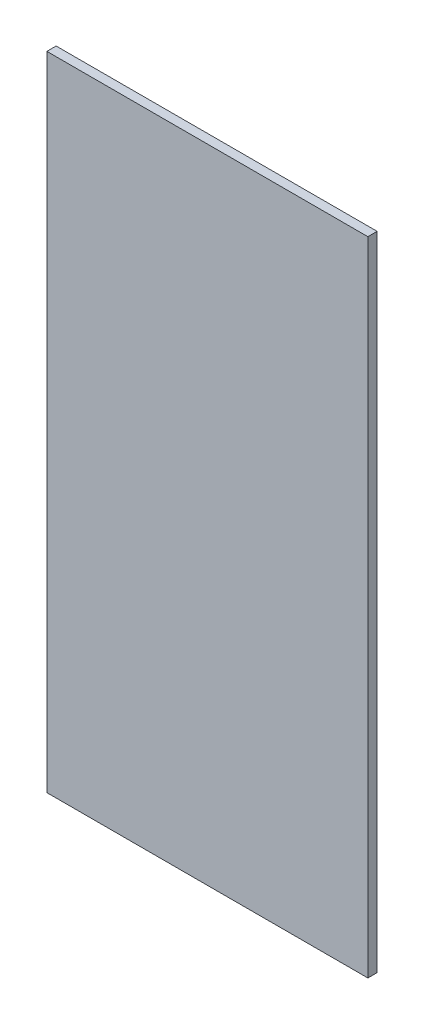
ISO-10303-21;
HEADER;
FILE_DESCRIPTION(('STEP AP214'),'2;1');
FILE_NAME('part.step','',(''),(''),'','','');
FILE_SCHEMA(('AUTOMOTIVE_DESIGN { 1 0 10303 214 1 1 1 1 }'));
ENDSEC;
DATA;
#1=APPLICATION_CONTEXT('core data for automotive mechanical design processes');
#2=APPLICATION_PROTOCOL_DEFINITION('international standard','automotive_design',2000,#1);
#3=PRODUCT_CONTEXT('',#1,'mechanical');
#4=PRODUCT('Part','Part','',(#3));
#5=PRODUCT_RELATED_PRODUCT_CATEGORY('part','',(#4));
#6=PRODUCT_DEFINITION_FORMATION('','',#4);
#7=PRODUCT_DEFINITION_CONTEXT('part definition',#1,'design');
#8=PRODUCT_DEFINITION('design','',#6,#7);
#9=PRODUCT_DEFINITION_SHAPE('','',#8);
#10=(LENGTH_UNIT() NAMED_UNIT(*) SI_UNIT(.MILLI.,.METRE.));
#11=(NAMED_UNIT(*) PLANE_ANGLE_UNIT() SI_UNIT($,.RADIAN.));
#12=(NAMED_UNIT(*) SI_UNIT($,.STERADIAN.) SOLID_ANGLE_UNIT());
#13=UNCERTAINTY_MEASURE_WITH_UNIT(LENGTH_MEASURE(1.E-05),#10,'distance_accuracy_value','');
#14=(GEOMETRIC_REPRESENTATION_CONTEXT(3) GLOBAL_UNCERTAINTY_ASSIGNED_CONTEXT((#13)) GLOBAL_UNIT_ASSIGNED_CONTEXT((#10,
#11,#12)) REPRESENTATION_CONTEXT('',''));
#15=CARTESIAN_POINT('',(0.,0.,0.));
#16=DIRECTION('',(0.,0.,1.));
#17=DIRECTION('',(1.,0.,0.));
#18=AXIS2_PLACEMENT_3D('',#15,#16,#17);
#19=CARTESIAN_POINT('',(-82.5500000000001,165.1,4.7625));
#20=DIRECTION('',(1.,0.,0.));
#21=DIRECTION('',(0.,1.,0.));
#22=AXIS2_PLACEMENT_3D('',#19,#20,#21);
#23=PLANE('',#22);
#24=DIRECTION('',(0.,-1.,0.));
#25=VECTOR('',#24,1.);
#26=CARTESIAN_POINT('',(-82.5500000000001,165.1,0.));
#27=LINE('',#26,#25);
#28=CARTESIAN_POINT('',(-82.5500000000001,165.1,0.));
#29=VERTEX_POINT('',#28);
#30=CARTESIAN_POINT('',(-82.55,-165.1,0.));
#31=VERTEX_POINT('',#30);
#32=EDGE_CURVE('E100',#29,#31,#27,.T.);
#33=ORIENTED_EDGE('',*,*,#32,.T.);
#34=DIRECTION('',(0.,0.,-1.));
#35=VECTOR('',#34,1.);
#36=CARTESIAN_POINT('',(-82.55,-165.1,4.7625));
#37=LINE('',#36,#35);
#38=CARTESIAN_POINT('',(-82.55,-165.1,4.7625));
#39=VERTEX_POINT('',#38);
#40=EDGE_CURVE('E11',#39,#31,#37,.T.);
#41=ORIENTED_EDGE('',*,*,#40,.F.);
#42=DIRECTION('',(0.,-1.,0.));
#43=VECTOR('',#42,1.);
#44=CARTESIAN_POINT('',(-82.5500000000001,165.1,4.7625));
#45=LINE('',#44,#43);
#46=CARTESIAN_POINT('',(-82.5500000000001,165.1,4.7625));
#47=VERTEX_POINT('',#46);
#48=EDGE_CURVE('E88',#47,#39,#45,.T.);
#49=ORIENTED_EDGE('',*,*,#48,.F.);
#50=DIRECTION('',(0.,0.,-1.));
#51=VECTOR('',#50,1.);
#52=CARTESIAN_POINT('',(-82.5500000000001,165.1,4.7625));
#53=LINE('',#52,#51);
#54=EDGE_CURVE('E96',#47,#29,#53,.T.);
#55=ORIENTED_EDGE('',*,*,#54,.T.);
#56=EDGE_LOOP('',(#33,#41,#49,#55));
#57=FACE_BOUND('',#56,.T.);
#58=ADVANCED_FACE('F37',(#57),#23,.F.);
#59=CARTESIAN_POINT('',(-82.55,-165.1,4.7625));
#60=DIRECTION('',(0.,1.,0.));
#61=DIRECTION('',(-1.,0.,0.));
#62=AXIS2_PLACEMENT_3D('',#59,#60,#61);
#63=PLANE('',#62);
#64=DIRECTION('',(1.,0.,0.));
#65=VECTOR('',#64,1.);
#66=CARTESIAN_POINT('',(-82.55,-165.1,0.));
#67=LINE('',#66,#65);
#68=CARTESIAN_POINT('',(82.55,-165.1,0.));
#69=VERTEX_POINT('',#68);
#70=EDGE_CURVE('E92',#31,#69,#67,.T.);
#71=ORIENTED_EDGE('',*,*,#70,.T.);
#72=DIRECTION('',(0.,0.,-1.));
#73=VECTOR('',#72,1.);
#74=CARTESIAN_POINT('',(82.55,-165.1,4.7625));
#75=LINE('',#74,#73);
#76=CARTESIAN_POINT('',(82.55,-165.1,4.7625));
#77=VERTEX_POINT('',#76);
#78=EDGE_CURVE('E45',#77,#69,#75,.T.);
#79=ORIENTED_EDGE('',*,*,#78,.F.);
#80=DIRECTION('',(1.,0.,0.));
#81=VECTOR('',#80,1.);
#82=CARTESIAN_POINT('',(-82.55,-165.1,4.7625));
#83=LINE('',#82,#81);
#84=EDGE_CURVE('E83',#39,#77,#83,.T.);
#85=ORIENTED_EDGE('',*,*,#84,.F.);
#86=ORIENTED_EDGE('',*,*,#40,.T.);
#87=EDGE_LOOP('',(#71,#79,#85,#86));
#88=FACE_BOUND('',#87,.T.);
#89=ADVANCED_FACE('F91',(#88),#63,.F.);
#90=CARTESIAN_POINT('',(82.5499999999999,165.1,4.7625));
#91=DIRECTION('',(-1.,0.,0.));
#92=DIRECTION('',(0.,-1.,0.));
#93=AXIS2_PLACEMENT_3D('',#90,#91,#92);
#94=PLANE('',#93);
#95=DIRECTION('',(0.,1.,0.));
#96=VECTOR('',#95,1.);
#97=CARTESIAN_POINT('',(82.5499999999999,165.1,0.));
#98=LINE('',#97,#96);
#99=CARTESIAN_POINT('',(82.5499999999999,165.1,0.));
#100=VERTEX_POINT('',#99);
#101=EDGE_CURVE('E70',#69,#100,#98,.T.);
#102=ORIENTED_EDGE('',*,*,#101,.T.);
#103=DIRECTION('',(0.,0.,-1.));
#104=VECTOR('',#103,1.);
#105=CARTESIAN_POINT('',(82.5499999999999,165.1,4.7625));
#106=LINE('',#105,#104);
#107=CARTESIAN_POINT('',(82.5499999999999,165.1,4.7625));
#108=VERTEX_POINT('',#107);
#109=EDGE_CURVE('E93',#108,#100,#106,.T.);
#110=ORIENTED_EDGE('',*,*,#109,.F.);
#111=DIRECTION('',(0.,1.,0.));
#112=VECTOR('',#111,1.);
#113=CARTESIAN_POINT('',(82.5499999999999,165.1,4.7625));
#114=LINE('',#113,#112);
#115=EDGE_CURVE('E86',#77,#108,#114,.T.);
#116=ORIENTED_EDGE('',*,*,#115,.F.);
#117=ORIENTED_EDGE('',*,*,#78,.T.);
#118=EDGE_LOOP('',(#102,#110,#116,#117));
#119=FACE_BOUND('',#118,.T.);
#120=ADVANCED_FACE('F94',(#119),#94,.F.);
#121=CARTESIAN_POINT('',(-82.5500000000001,165.1,4.7625));
#122=DIRECTION('',(0.,-1.,0.));
#123=DIRECTION('',(1.,0.,0.));
#124=AXIS2_PLACEMENT_3D('',#121,#122,#123);
#125=PLANE('',#124);
#126=DIRECTION('',(-1.,0.,0.));
#127=VECTOR('',#126,1.);
#128=CARTESIAN_POINT('',(-82.5500000000001,165.1,0.));
#129=LINE('',#128,#127);
#130=EDGE_CURVE('E76',#100,#29,#129,.T.);
#131=ORIENTED_EDGE('',*,*,#130,.T.);
#132=ORIENTED_EDGE('',*,*,#54,.F.);
#133=DIRECTION('',(-1.,0.,0.));
#134=VECTOR('',#133,1.);
#135=CARTESIAN_POINT('',(-82.5500000000001,165.1,4.7625));
#136=LINE('',#135,#134);
#137=EDGE_CURVE('E53',#108,#47,#136,.T.);
#138=ORIENTED_EDGE('',*,*,#137,.F.);
#139=ORIENTED_EDGE('',*,*,#109,.T.);
#140=EDGE_LOOP('',(#131,#132,#138,#139));
#141=FACE_BOUND('',#140,.T.);
#142=ADVANCED_FACE('F107',(#141),#125,.F.);
#143=CARTESIAN_POINT('',(0.,0.,4.7625));
#144=DIRECTION('',(0.,0.,1.));
#145=DIRECTION('',(1.,0.,0.));
#146=AXIS2_PLACEMENT_3D('',#143,#144,#145);
#147=PLANE('',#146);
#148=ORIENTED_EDGE('',*,*,#48,.T.);
#149=ORIENTED_EDGE('',*,*,#84,.T.);
#150=ORIENTED_EDGE('',*,*,#115,.T.);
#151=ORIENTED_EDGE('',*,*,#137,.T.);
#152=EDGE_LOOP('',(#148,#149,#150,#151));
#153=FACE_BOUND('',#152,.T.);
#154=ADVANCED_FACE('F84',(#153),#147,.T.);
#155=CARTESIAN_POINT('',(0.,0.,0.));
#156=DIRECTION('',(0.,0.,1.));
#157=DIRECTION('',(1.,0.,0.));
#158=AXIS2_PLACEMENT_3D('',#155,#156,#157);
#159=PLANE('',#158);
#160=ORIENTED_EDGE('',*,*,#32,.F.);
#161=ORIENTED_EDGE('',*,*,#130,.F.);
#162=ORIENTED_EDGE('',*,*,#101,.F.);
#163=ORIENTED_EDGE('',*,*,#70,.F.);
#164=EDGE_LOOP('',(#160,#161,#162,#163));
#165=FACE_BOUND('',#164,.T.);
#166=ADVANCED_FACE('F110',(#165),#159,.F.);
#167=CLOSED_SHELL('',(#58,#89,#120,#142,#154,#166));
#168=MANIFOLD_SOLID_BREP('B2',#167);
#169=ADVANCED_BREP_SHAPE_REPRESENTATION('',(#18,#168),#14);
#170=SHAPE_DEFINITION_REPRESENTATION(#9,#169);
ENDSEC;
END-ISO-10303-21;
